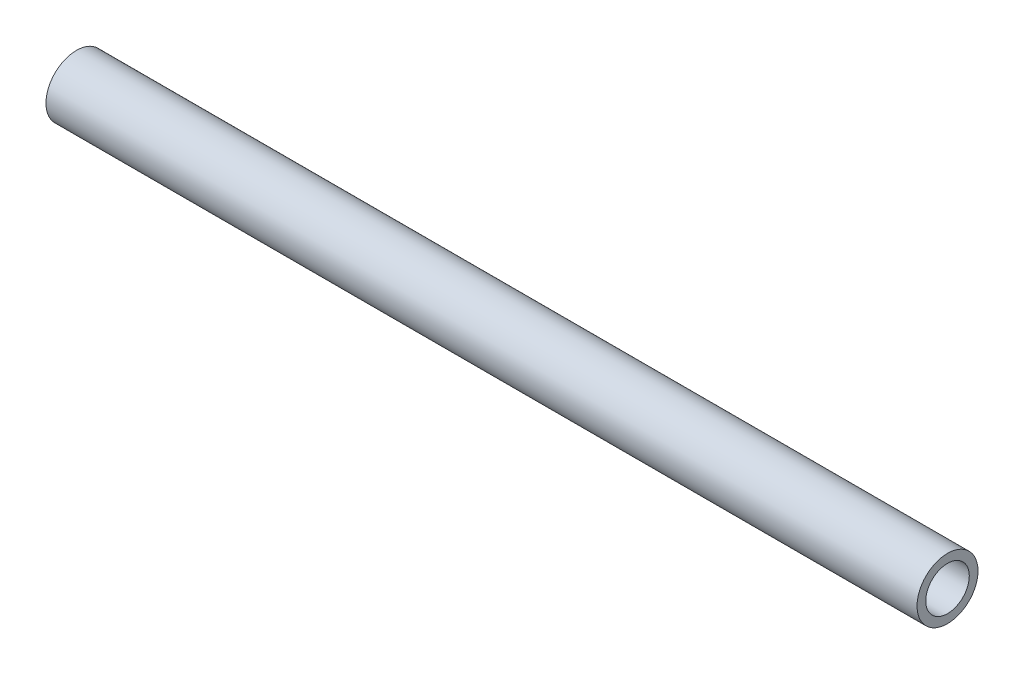
ISO-10303-21;
HEADER;
FILE_DESCRIPTION(('STEP AP214'),'2;1');
FILE_NAME('part.step','',(''),(''),'','','');
FILE_SCHEMA(('AUTOMOTIVE_DESIGN { 1 0 10303 214 1 1 1 1 }'));
ENDSEC;
DATA;
#1=APPLICATION_CONTEXT('core data for automotive mechanical design processes');
#2=APPLICATION_PROTOCOL_DEFINITION('international standard','automotive_design',2000,#1);
#3=PRODUCT_CONTEXT('',#1,'mechanical');
#4=PRODUCT('Part','Part','',(#3));
#5=PRODUCT_RELATED_PRODUCT_CATEGORY('part','',(#4));
#6=PRODUCT_DEFINITION_FORMATION('','',#4);
#7=PRODUCT_DEFINITION_CONTEXT('part definition',#1,'design');
#8=PRODUCT_DEFINITION('design','',#6,#7);
#9=PRODUCT_DEFINITION_SHAPE('','',#8);
#10=(LENGTH_UNIT() NAMED_UNIT(*) SI_UNIT(.MILLI.,.METRE.));
#11=(NAMED_UNIT(*) PLANE_ANGLE_UNIT() SI_UNIT($,.RADIAN.));
#12=(NAMED_UNIT(*) SI_UNIT($,.STERADIAN.) SOLID_ANGLE_UNIT());
#13=UNCERTAINTY_MEASURE_WITH_UNIT(LENGTH_MEASURE(1.E-05),#10,'distance_accuracy_value','');
#14=(GEOMETRIC_REPRESENTATION_CONTEXT(3) GLOBAL_UNCERTAINTY_ASSIGNED_CONTEXT((#13)) GLOBAL_UNIT_ASSIGNED_CONTEXT((#10,
#11,#12)) REPRESENTATION_CONTEXT('',''));
#15=CARTESIAN_POINT('',(0.,0.,0.));
#16=DIRECTION('',(0.,0.,1.));
#17=DIRECTION('',(1.,0.,0.));
#18=AXIS2_PLACEMENT_3D('',#15,#16,#17);
#19=CARTESIAN_POINT('',(63.5,0.,0.));
#20=DIRECTION('',(1.,0.,0.));
#21=DIRECTION('',(0.,0.,-1.));
#22=AXIS2_PLACEMENT_3D('',#19,#20,#21);
#23=PLANE('',#22);
#24=CARTESIAN_POINT('',(63.5,0.,0.));
#25=DIRECTION('',(1.,0.,0.));
#26=DIRECTION('',(0.,0.,-1.));
#27=AXIS2_PLACEMENT_3D('',#24,#25,#26);
#28=CIRCLE('',#27,4.445);
#29=CARTESIAN_POINT('',(63.5,0.,-4.445));
#30=VERTEX_POINT('',#29);
#31=EDGE_CURVE('E10',#30,#30,#28,.T.);
#32=ORIENTED_EDGE('',*,*,#31,.T.);
#33=EDGE_LOOP('',(#32));
#34=FACE_BOUND('',#33,.T.);
#35=CARTESIAN_POINT('',(63.5,0.,0.));
#36=DIRECTION('',(1.,0.,0.));
#37=DIRECTION('',(0.,0.,-1.));
#38=AXIS2_PLACEMENT_3D('',#35,#36,#37);
#39=CIRCLE('',#38,3.175);
#40=CARTESIAN_POINT('',(63.5,0.,-3.175));
#41=VERTEX_POINT('',#40);
#42=EDGE_CURVE('E50',#41,#41,#39,.T.);
#43=ORIENTED_EDGE('',*,*,#42,.F.);
#44=EDGE_LOOP('',(#43));
#45=FACE_BOUND('',#44,.T.);
#46=ADVANCED_FACE('F37',(#34,#45),#23,.T.);
#47=CARTESIAN_POINT('',(-63.5,0.,0.));
#48=DIRECTION('',(1.,0.,0.));
#49=DIRECTION('',(0.,0.,-1.));
#50=AXIS2_PLACEMENT_3D('',#47,#48,#49);
#51=PLANE('',#50);
#52=CARTESIAN_POINT('',(-63.5,0.,0.));
#53=DIRECTION('',(1.,0.,0.));
#54=DIRECTION('',(0.,0.,-1.));
#55=AXIS2_PLACEMENT_3D('',#52,#53,#54);
#56=CIRCLE('',#55,4.445);
#57=CARTESIAN_POINT('',(-63.5,0.,-4.445));
#58=VERTEX_POINT('',#57);
#59=EDGE_CURVE('E41',#58,#58,#56,.T.);
#60=ORIENTED_EDGE('',*,*,#59,.F.);
#61=EDGE_LOOP('',(#60));
#62=FACE_BOUND('',#61,.T.);
#63=CARTESIAN_POINT('',(-63.5,0.,0.));
#64=DIRECTION('',(1.,0.,0.));
#65=DIRECTION('',(0.,0.,-1.));
#66=AXIS2_PLACEMENT_3D('',#63,#64,#65);
#67=CIRCLE('',#66,3.175);
#68=CARTESIAN_POINT('',(-63.5,0.,-3.175));
#69=VERTEX_POINT('',#68);
#70=EDGE_CURVE('E52',#69,#69,#67,.T.);
#71=ORIENTED_EDGE('',*,*,#70,.T.);
#72=EDGE_LOOP('',(#71));
#73=FACE_BOUND('',#72,.T.);
#74=ADVANCED_FACE('F64',(#62,#73),#51,.F.);
#75=CARTESIAN_POINT('',(63.5,0.,0.));
#76=DIRECTION('',(-1.,0.,0.));
#77=DIRECTION('',(0.,0.,1.));
#78=AXIS2_PLACEMENT_3D('',#75,#76,#77);
#79=CYLINDRICAL_SURFACE('',#78,4.445);
#80=ORIENTED_EDGE('',*,*,#31,.F.);
#81=EDGE_LOOP('',(#80));
#82=FACE_BOUND('',#81,.T.);
#83=ORIENTED_EDGE('',*,*,#59,.T.);
#84=EDGE_LOOP('',(#83));
#85=FACE_BOUND('',#84,.T.);
#86=ADVANCED_FACE('F39',(#82,#85),#79,.T.);
#87=CARTESIAN_POINT('',(63.5,0.,0.));
#88=DIRECTION('',(-1.,0.,0.));
#89=DIRECTION('',(0.,0.,1.));
#90=AXIS2_PLACEMENT_3D('',#87,#88,#89);
#91=CYLINDRICAL_SURFACE('',#90,3.175);
#92=ORIENTED_EDGE('',*,*,#42,.T.);
#93=EDGE_LOOP('',(#92));
#94=FACE_BOUND('',#93,.T.);
#95=ORIENTED_EDGE('',*,*,#70,.F.);
#96=EDGE_LOOP('',(#95));
#97=FACE_BOUND('',#96,.T.);
#98=ADVANCED_FACE('F60',(#94,#97),#91,.F.);
#99=CLOSED_SHELL('',(#46,#74,#86,#98));
#100=MANIFOLD_SOLID_BREP('B2',#99);
#101=ADVANCED_BREP_SHAPE_REPRESENTATION('',(#18,#100),#14);
#102=SHAPE_DEFINITION_REPRESENTATION(#9,#101);
ENDSEC;
END-ISO-10303-21;
